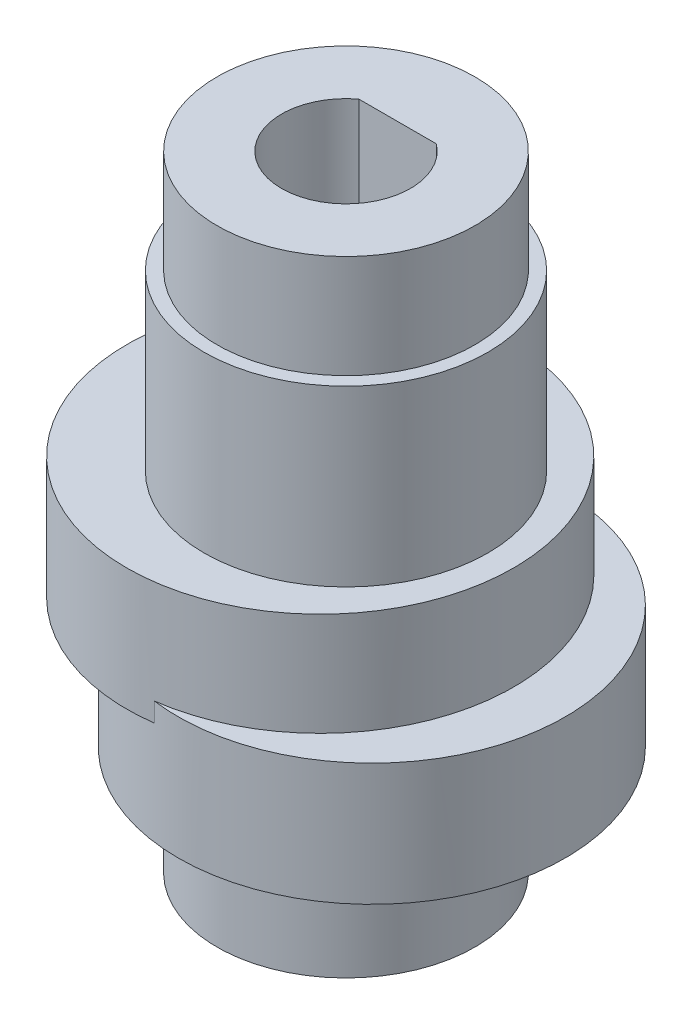
ISO-10303-21;
HEADER;
FILE_DESCRIPTION(('STEP AP214'),'2;1');
FILE_NAME('part.step','',(''),(''),'','','');
FILE_SCHEMA(('AUTOMOTIVE_DESIGN { 1 0 10303 214 1 1 1 1 }'));
ENDSEC;
DATA;
#1=APPLICATION_CONTEXT('core data for automotive mechanical design processes');
#2=APPLICATION_PROTOCOL_DEFINITION('international standard','automotive_design',2000,#1);
#3=PRODUCT_CONTEXT('',#1,'mechanical');
#4=PRODUCT('Part','Part','',(#3));
#5=PRODUCT_RELATED_PRODUCT_CATEGORY('part','',(#4));
#6=PRODUCT_DEFINITION_FORMATION('','',#4);
#7=PRODUCT_DEFINITION_CONTEXT('part definition',#1,'design');
#8=PRODUCT_DEFINITION('design','',#6,#7);
#9=PRODUCT_DEFINITION_SHAPE('','',#8);
#10=(LENGTH_UNIT() NAMED_UNIT(*) SI_UNIT(.MILLI.,.METRE.));
#11=(NAMED_UNIT(*) PLANE_ANGLE_UNIT() SI_UNIT($,.RADIAN.));
#12=(NAMED_UNIT(*) SI_UNIT($,.STERADIAN.) SOLID_ANGLE_UNIT());
#13=UNCERTAINTY_MEASURE_WITH_UNIT(LENGTH_MEASURE(1.E-05),#10,'distance_accuracy_value','');
#14=(GEOMETRIC_REPRESENTATION_CONTEXT(3) GLOBAL_UNCERTAINTY_ASSIGNED_CONTEXT((#13)) GLOBAL_UNIT_ASSIGNED_CONTEXT((#10,
#11,#12)) REPRESENTATION_CONTEXT('',''));
#15=CARTESIAN_POINT('',(0.,0.,0.));
#16=DIRECTION('',(0.,0.,1.));
#17=DIRECTION('',(1.,0.,0.));
#18=AXIS2_PLACEMENT_3D('',#15,#16,#17);
#19=CARTESIAN_POINT('',(0.,-4.,0.));
#20=DIRECTION('',(0.,1.,0.));
#21=DIRECTION('',(0.,0.,1.));
#22=AXIS2_PLACEMENT_3D('',#19,#20,#21);
#23=PLANE('',#22);
#24=CARTESIAN_POINT('',(1.,-4.,0.));
#25=DIRECTION('',(0.,1.,0.));
#26=DIRECTION('',(0.,0.,1.));
#27=AXIS2_PLACEMENT_3D('',#24,#25,#26);
#28=CIRCLE('',#27,7.5);
#29=CARTESIAN_POINT('',(1.,-4.,7.5));
#30=VERTEX_POINT('',#29);
#31=EDGE_CURVE('E128',#30,#30,#28,.T.);
#32=ORIENTED_EDGE('',*,*,#31,.F.);
#33=EDGE_LOOP('',(#32));
#34=FACE_BOUND('',#33,.T.);
#35=CARTESIAN_POINT('',(0.,-4.,0.));
#36=DIRECTION('',(0.,1.,0.));
#37=DIRECTION('',(0.,0.,1.));
#38=AXIS2_PLACEMENT_3D('',#35,#36,#37);
#39=CIRCLE('',#38,5.5);
#40=CARTESIAN_POINT('',(0.,-4.,5.5));
#41=VERTEX_POINT('',#40);
#42=EDGE_CURVE('E51',#41,#41,#39,.F.);
#43=ORIENTED_EDGE('',*,*,#42,.F.);
#44=EDGE_LOOP('',(#43));
#45=FACE_BOUND('',#44,.T.);
#46=ADVANCED_FACE('F43',(#34,#45),#23,.F.);
#47=CARTESIAN_POINT('',(-1.,4.74,0.));
#48=DIRECTION('',(0.,-1.,0.));
#49=DIRECTION('',(0.,0.,-1.));
#50=AXIS2_PLACEMENT_3D('',#47,#48,#49);
#51=CYLINDRICAL_SURFACE('',#50,7.5);
#52=CARTESIAN_POINT('',(-1.,4.74,0.));
#53=DIRECTION('',(0.,1.,0.));
#54=DIRECTION('',(0.,0.,1.));
#55=AXIS2_PLACEMENT_3D('',#52,#53,#54);
#56=CIRCLE('',#55,7.5);
#57=CARTESIAN_POINT('',(-1.,4.74,7.5));
#58=VERTEX_POINT('',#57);
#59=EDGE_CURVE('E139',#58,#58,#56,.T.);
#60=ORIENTED_EDGE('',*,*,#59,.F.);
#61=EDGE_LOOP('',(#60));
#62=FACE_BOUND('',#61,.T.);
#63=DIRECTION('',(0.,-1.,0.));
#64=VECTOR('',#63,1.);
#65=CARTESIAN_POINT('',(0.,0.74,7.43303437365925));
#66=LINE('',#65,#64);
#67=CARTESIAN_POINT('',(0.,0.74,7.43303437365925));
#68=VERTEX_POINT('',#67);
#69=CARTESIAN_POINT('',(0.,0.,7.43303437365925));
#70=VERTEX_POINT('',#69);
#71=EDGE_CURVE('E63',#68,#70,#66,.T.);
#72=ORIENTED_EDGE('',*,*,#71,.F.);
#73=CARTESIAN_POINT('',(-1.,0.74,0.));
#74=DIRECTION('',(0.,1.,0.));
#75=DIRECTION('',(0.,0.,1.));
#76=AXIS2_PLACEMENT_3D('',#73,#74,#75);
#77=CIRCLE('',#76,7.5);
#78=CARTESIAN_POINT('',(0.,0.74,-7.43303437365925));
#79=VERTEX_POINT('',#78);
#80=EDGE_CURVE('E58',#68,#79,#77,.T.);
#81=ORIENTED_EDGE('',*,*,#80,.T.);
#82=DIRECTION('',(0.,-1.,0.));
#83=VECTOR('',#82,1.);
#84=CARTESIAN_POINT('',(0.,0.74,-7.43303437365925));
#85=LINE('',#84,#83);
#86=CARTESIAN_POINT('',(0.,0.,-7.43303437365925));
#87=VERTEX_POINT('',#86);
#88=EDGE_CURVE('E135',#79,#87,#85,.T.);
#89=ORIENTED_EDGE('',*,*,#88,.T.);
#90=CARTESIAN_POINT('',(-1.,0.,0.));
#91=DIRECTION('',(0.,1.,0.));
#92=DIRECTION('',(0.,0.,1.));
#93=AXIS2_PLACEMENT_3D('',#90,#91,#92);
#94=CIRCLE('',#93,7.5);
#95=EDGE_CURVE('E138',#87,#70,#94,.T.);
#96=ORIENTED_EDGE('',*,*,#95,.T.);
#97=EDGE_LOOP('',(#72,#81,#89,#96));
#98=FACE_BOUND('',#97,.T.);
#99=ADVANCED_FACE('F45',(#62,#98),#51,.T.);
#100=CARTESIAN_POINT('',(0.,4.74,0.));
#101=DIRECTION('',(0.,-1.,0.));
#102=DIRECTION('',(0.,0.,-1.));
#103=AXIS2_PLACEMENT_3D('',#100,#101,#102);
#104=CYLINDRICAL_SURFACE('',#103,2.5);
#105=CARTESIAN_POINT('',(0.,-8.74,0.));
#106=DIRECTION('',(0.,-1.,0.));
#107=DIRECTION('',(0.,0.,-1.));
#108=AXIS2_PLACEMENT_3D('',#105,#106,#107);
#109=CIRCLE('',#108,2.5);
#110=CARTESIAN_POINT('',(-1.5,-8.74,-2.));
#111=VERTEX_POINT('',#110);
#112=CARTESIAN_POINT('',(1.5,-8.74,-2.));
#113=VERTEX_POINT('',#112);
#114=EDGE_CURVE('E91',#111,#113,#109,.F.);
#115=ORIENTED_EDGE('',*,*,#114,.F.);
#116=DIRECTION('',(0.,-1.,0.));
#117=VECTOR('',#116,1.);
#118=CARTESIAN_POINT('',(-1.5,4.74,-2.));
#119=LINE('',#118,#117);
#120=CARTESIAN_POINT('',(-1.5,15.48,-2.));
#121=VERTEX_POINT('',#120);
#122=EDGE_CURVE('E85',#121,#111,#119,.T.);
#123=ORIENTED_EDGE('',*,*,#122,.F.);
#124=CARTESIAN_POINT('',(0.,15.48,0.));
#125=DIRECTION('',(0.,-1.,0.));
#126=DIRECTION('',(0.,0.,-1.));
#127=AXIS2_PLACEMENT_3D('',#124,#125,#126);
#128=CIRCLE('',#127,2.5);
#129=CARTESIAN_POINT('',(1.5,15.48,-2.));
#130=VERTEX_POINT('',#129);
#131=EDGE_CURVE('E89',#121,#130,#128,.F.);
#132=ORIENTED_EDGE('',*,*,#131,.T.);
#133=DIRECTION('',(0.,-1.,0.));
#134=VECTOR('',#133,1.);
#135=CARTESIAN_POINT('',(1.5,4.74,-2.));
#136=LINE('',#135,#134);
#137=EDGE_CURVE('E95',#130,#113,#136,.T.);
#138=ORIENTED_EDGE('',*,*,#137,.T.);
#139=EDGE_LOOP('',(#115,#123,#132,#138));
#140=FACE_BOUND('',#139,.T.);
#141=ADVANCED_FACE('F87',(#140),#104,.F.);
#142=CARTESIAN_POINT('',(0.,4.74,-2.));
#143=DIRECTION('',(0.,0.,-1.));
#144=DIRECTION('',(-1.,0.,0.));
#145=AXIS2_PLACEMENT_3D('',#142,#143,#144);
#146=PLANE('',#145);
#147=DIRECTION('',(-1.,0.,0.));
#148=VECTOR('',#147,1.);
#149=CARTESIAN_POINT('',(0.,-8.74,-2.));
#150=LINE('',#149,#148);
#151=EDGE_CURVE('E121',#113,#111,#150,.T.);
#152=ORIENTED_EDGE('',*,*,#151,.F.);
#153=ORIENTED_EDGE('',*,*,#137,.F.);
#154=DIRECTION('',(-1.,0.,0.));
#155=VECTOR('',#154,1.);
#156=CARTESIAN_POINT('',(0.,15.48,-2.));
#157=LINE('',#156,#155);
#158=EDGE_CURVE('E98',#130,#121,#157,.T.);
#159=ORIENTED_EDGE('',*,*,#158,.T.);
#160=ORIENTED_EDGE('',*,*,#122,.T.);
#161=EDGE_LOOP('',(#152,#153,#159,#160));
#162=FACE_BOUND('',#161,.T.);
#163=ADVANCED_FACE('F99',(#162),#146,.F.);
#164=CARTESIAN_POINT('',(0.,4.74,0.));
#165=DIRECTION('',(0.,1.,0.));
#166=DIRECTION('',(0.,0.,1.));
#167=AXIS2_PLACEMENT_3D('',#164,#165,#166);
#168=PLANE('',#167);
#169=CARTESIAN_POINT('',(0.,4.74,0.));
#170=DIRECTION('',(0.,1.,0.));
#171=DIRECTION('',(0.,0.,1.));
#172=AXIS2_PLACEMENT_3D('',#169,#170,#171);
#173=CIRCLE('',#172,5.5);
#174=CARTESIAN_POINT('',(0.,4.74,-5.5));
#175=VERTEX_POINT('',#174);
#176=EDGE_CURVE('E11',#175,#175,#173,.T.);
#177=ORIENTED_EDGE('',*,*,#176,.F.);
#178=EDGE_LOOP('',(#177));
#179=FACE_BOUND('',#178,.T.);
#180=ORIENTED_EDGE('',*,*,#59,.T.);
#181=EDGE_LOOP('',(#180));
#182=FACE_BOUND('',#181,.T.);
#183=ADVANCED_FACE('F169',(#179,#182),#168,.T.);
#184=CARTESIAN_POINT('',(0.,0.,0.));
#185=DIRECTION('',(0.,1.,0.));
#186=DIRECTION('',(0.,0.,1.));
#187=AXIS2_PLACEMENT_3D('',#184,#185,#186);
#188=PLANE('',#187);
#189=ORIENTED_EDGE('',*,*,#95,.F.);
#190=CARTESIAN_POINT('',(1.,0.,0.));
#191=DIRECTION('',(0.,1.,0.));
#192=DIRECTION('',(0.,0.,1.));
#193=AXIS2_PLACEMENT_3D('',#190,#191,#192);
#194=CIRCLE('',#193,7.5);
#195=EDGE_CURVE('E127',#87,#70,#194,.T.);
#196=ORIENTED_EDGE('',*,*,#195,.T.);
#197=EDGE_LOOP('',(#189,#196));
#198=FACE_BOUND('',#197,.T.);
#199=ADVANCED_FACE('F167',(#198),#188,.F.);
#200=CARTESIAN_POINT('',(1.,0.74,0.));
#201=DIRECTION('',(0.,-1.,0.));
#202=DIRECTION('',(0.,0.,-1.));
#203=AXIS2_PLACEMENT_3D('',#200,#201,#202);
#204=CYLINDRICAL_SURFACE('',#203,7.5);
#205=ORIENTED_EDGE('',*,*,#71,.T.);
#206=ORIENTED_EDGE('',*,*,#195,.F.);
#207=ORIENTED_EDGE('',*,*,#88,.F.);
#208=CARTESIAN_POINT('',(1.,0.74,0.));
#209=DIRECTION('',(0.,1.,0.));
#210=DIRECTION('',(0.,0.,1.));
#211=AXIS2_PLACEMENT_3D('',#208,#209,#210);
#212=CIRCLE('',#211,7.5);
#213=EDGE_CURVE('E133',#68,#79,#212,.T.);
#214=ORIENTED_EDGE('',*,*,#213,.F.);
#215=EDGE_LOOP('',(#205,#206,#207,#214));
#216=FACE_BOUND('',#215,.T.);
#217=ORIENTED_EDGE('',*,*,#31,.T.);
#218=EDGE_LOOP('',(#217));
#219=FACE_BOUND('',#218,.T.);
#220=ADVANCED_FACE('F163',(#216,#219),#204,.T.);
#221=CARTESIAN_POINT('',(0.,0.74,0.));
#222=DIRECTION('',(0.,1.,0.));
#223=DIRECTION('',(0.,0.,1.));
#224=AXIS2_PLACEMENT_3D('',#221,#222,#223);
#225=PLANE('',#224);
#226=ORIENTED_EDGE('',*,*,#80,.F.);
#227=ORIENTED_EDGE('',*,*,#213,.T.);
#228=EDGE_LOOP('',(#226,#227));
#229=FACE_BOUND('',#228,.T.);
#230=ADVANCED_FACE('F160',(#229),#225,.T.);
#231=CARTESIAN_POINT('',(0.,-8.74,0.));
#232=DIRECTION('',(0.,1.,0.));
#233=DIRECTION('',(0.,0.,1.));
#234=AXIS2_PLACEMENT_3D('',#231,#232,#233);
#235=CYLINDRICAL_SURFACE('',#234,5.);
#236=CARTESIAN_POINT('',(0.,-4.74,0.));
#237=DIRECTION('',(0.,-1.,0.));
#238=DIRECTION('',(0.,0.,-1.));
#239=AXIS2_PLACEMENT_3D('',#236,#237,#238);
#240=CIRCLE('',#239,5.);
#241=CARTESIAN_POINT('',(0.,-4.74,-5.));
#242=VERTEX_POINT('',#241);
#243=EDGE_CURVE('E115',#242,#242,#240,.T.);
#244=ORIENTED_EDGE('',*,*,#243,.T.);
#245=EDGE_LOOP('',(#244));
#246=FACE_BOUND('',#245,.T.);
#247=CARTESIAN_POINT('',(0.,-8.74,0.));
#248=DIRECTION('',(0.,-1.,0.));
#249=DIRECTION('',(0.,0.,-1.));
#250=AXIS2_PLACEMENT_3D('',#247,#248,#249);
#251=CIRCLE('',#250,5.);
#252=CARTESIAN_POINT('',(0.,-8.74,-5.));
#253=VERTEX_POINT('',#252);
#254=EDGE_CURVE('E124',#253,#253,#251,.T.);
#255=ORIENTED_EDGE('',*,*,#254,.F.);
#256=EDGE_LOOP('',(#255));
#257=FACE_BOUND('',#256,.T.);
#258=ADVANCED_FACE('F158',(#246,#257),#235,.T.);
#259=CARTESIAN_POINT('',(0.,-8.74,0.));
#260=DIRECTION('',(0.,-1.,0.));
#261=DIRECTION('',(0.,0.,-1.));
#262=AXIS2_PLACEMENT_3D('',#259,#260,#261);
#263=PLANE('',#262);
#264=ORIENTED_EDGE('',*,*,#151,.T.);
#265=ORIENTED_EDGE('',*,*,#114,.T.);
#266=EDGE_LOOP('',(#264,#265));
#267=FACE_BOUND('',#266,.T.);
#268=ORIENTED_EDGE('',*,*,#254,.T.);
#269=EDGE_LOOP('',(#268));
#270=FACE_BOUND('',#269,.T.);
#271=ADVANCED_FACE('F213',(#267,#270),#263,.T.);
#272=CARTESIAN_POINT('',(0.,-4.74,0.));
#273=DIRECTION('',(0.,-1.,0.));
#274=DIRECTION('',(0.,0.,-1.));
#275=AXIS2_PLACEMENT_3D('',#272,#273,#274);
#276=PLANE('',#275);
#277=CARTESIAN_POINT('',(0.,-4.74,0.));
#278=DIRECTION('',(0.,-1.,0.));
#279=DIRECTION('',(0.,0.,-1.));
#280=AXIS2_PLACEMENT_3D('',#277,#278,#279);
#281=CIRCLE('',#280,5.5);
#282=CARTESIAN_POINT('',(0.,-4.74,-5.5));
#283=VERTEX_POINT('',#282);
#284=EDGE_CURVE('E118',#283,#283,#281,.T.);
#285=ORIENTED_EDGE('',*,*,#284,.T.);
#286=EDGE_LOOP('',(#285));
#287=FACE_BOUND('',#286,.T.);
#288=ORIENTED_EDGE('',*,*,#243,.F.);
#289=EDGE_LOOP('',(#288));
#290=FACE_BOUND('',#289,.T.);
#291=ADVANCED_FACE('F220',(#287,#290),#276,.T.);
#292=CARTESIAN_POINT('',(0.,-4.74,0.));
#293=DIRECTION('',(0.,1.,0.));
#294=DIRECTION('',(0.,0.,1.));
#295=AXIS2_PLACEMENT_3D('',#292,#293,#294);
#296=CYLINDRICAL_SURFACE('',#295,5.5);
#297=ORIENTED_EDGE('',*,*,#284,.F.);
#298=EDGE_LOOP('',(#297));
#299=FACE_BOUND('',#298,.T.);
#300=ORIENTED_EDGE('',*,*,#42,.T.);
#301=EDGE_LOOP('',(#300));
#302=FACE_BOUND('',#301,.T.);
#303=ADVANCED_FACE('F146',(#299,#302),#296,.T.);
#304=CARTESIAN_POINT('',(0.,11.48,0.));
#305=DIRECTION('',(0.,-1.,0.));
#306=DIRECTION('',(0.,0.,-1.));
#307=AXIS2_PLACEMENT_3D('',#304,#305,#306);
#308=CYLINDRICAL_SURFACE('',#307,5.5);
#309=CARTESIAN_POINT('',(0.,11.48,0.));
#310=DIRECTION('',(0.,-1.,0.));
#311=DIRECTION('',(0.,0.,-1.));
#312=AXIS2_PLACEMENT_3D('',#309,#310,#311);
#313=CIRCLE('',#312,5.5);
#314=CARTESIAN_POINT('',(0.,11.48,-5.5));
#315=VERTEX_POINT('',#314);
#316=EDGE_CURVE('E112',#315,#315,#313,.T.);
#317=CARTESIAN_POINT('',(0.,4.74,-5.5));
#318=CARTESIAN_POINT('',(0.,4.81020833333333,-5.5));
#319=CARTESIAN_POINT('',(0.,4.88041666666667,-5.5));
#320=CARTESIAN_POINT('',(0.,5.02083333333333,-5.5));
#321=CARTESIAN_POINT('',(0.,5.09104166666667,-5.5));
#322=CARTESIAN_POINT('',(0.,5.23145833333333,-5.5));
#323=CARTESIAN_POINT('',(0.,5.30166666666667,-5.5));
#324=CARTESIAN_POINT('',(0.,5.44208333333333,-5.5));
#325=CARTESIAN_POINT('',(0.,5.51229166666667,-5.5));
#326=CARTESIAN_POINT('',(0.,5.65270833333333,-5.5));
#327=CARTESIAN_POINT('',(0.,5.72291666666667,-5.5));
#328=CARTESIAN_POINT('',(0.,5.86333333333333,-5.5));
#329=CARTESIAN_POINT('',(0.,5.93354166666667,-5.5));
#330=CARTESIAN_POINT('',(0.,6.07395833333333,-5.5));
#331=CARTESIAN_POINT('',(0.,6.14416666666667,-5.5));
#332=CARTESIAN_POINT('',(0.,6.28458333333333,-5.5));
#333=CARTESIAN_POINT('',(0.,6.35479166666667,-5.5));
#334=CARTESIAN_POINT('',(0.,6.49520833333334,-5.5));
#335=CARTESIAN_POINT('',(0.,6.56541666666667,-5.5));
#336=CARTESIAN_POINT('',(0.,6.70583333333333,-5.5));
#337=CARTESIAN_POINT('',(0.,6.77604166666667,-5.5));
#338=CARTESIAN_POINT('',(0.,6.91645833333333,-5.5));
#339=CARTESIAN_POINT('',(0.,6.98666666666667,-5.5));
#340=CARTESIAN_POINT('',(0.,7.12708333333333,-5.5));
#341=CARTESIAN_POINT('',(0.,7.19729166666667,-5.5));
#342=CARTESIAN_POINT('',(0.,7.33770833333333,-5.5));
#343=CARTESIAN_POINT('',(0.,7.40791666666667,-5.5));
#344=CARTESIAN_POINT('',(0.,7.54833333333333,-5.5));
#345=CARTESIAN_POINT('',(0.,7.61854166666667,-5.5));
#346=CARTESIAN_POINT('',(0.,7.75895833333333,-5.5));
#347=CARTESIAN_POINT('',(0.,7.82916666666667,-5.5));
#348=CARTESIAN_POINT('',(0.,7.96958333333333,-5.5));
#349=CARTESIAN_POINT('',(0.,8.03979166666667,-5.5));
#350=CARTESIAN_POINT('',(0.,8.18020833333333,-5.5));
#351=CARTESIAN_POINT('',(0.,8.25041666666667,-5.5));
#352=CARTESIAN_POINT('',(0.,8.39083333333333,-5.5));
#353=CARTESIAN_POINT('',(0.,8.46104166666667,-5.5));
#354=CARTESIAN_POINT('',(0.,8.60145833333333,-5.5));
#355=CARTESIAN_POINT('',(0.,8.67166666666667,-5.5));
#356=CARTESIAN_POINT('',(0.,8.81208333333334,-5.5));
#357=CARTESIAN_POINT('',(0.,8.88229166666667,-5.5));
#358=CARTESIAN_POINT('',(0.,9.02270833333333,-5.5));
#359=CARTESIAN_POINT('',(0.,9.09291666666667,-5.5));
#360=CARTESIAN_POINT('',(0.,9.23333333333333,-5.5));
#361=CARTESIAN_POINT('',(0.,9.30354166666667,-5.5));
#362=CARTESIAN_POINT('',(0.,9.44395833333333,-5.5));
#363=CARTESIAN_POINT('',(0.,9.51416666666667,-5.5));
#364=CARTESIAN_POINT('',(0.,9.65458333333333,-5.5));
#365=CARTESIAN_POINT('',(0.,9.72479166666667,-5.5));
#366=CARTESIAN_POINT('',(0.,9.86520833333334,-5.5));
#367=CARTESIAN_POINT('',(0.,9.93541666666667,-5.5));
#368=CARTESIAN_POINT('',(0.,10.0758333333333,-5.5));
#369=CARTESIAN_POINT('',(0.,10.1460416666667,-5.5));
#370=CARTESIAN_POINT('',(0.,10.2864583333333,-5.5));
#371=CARTESIAN_POINT('',(0.,10.3566666666667,-5.5));
#372=CARTESIAN_POINT('',(0.,10.4970833333333,-5.5));
#373=CARTESIAN_POINT('',(0.,10.5672916666667,-5.5));
#374=CARTESIAN_POINT('',(0.,10.7077083333333,-5.5));
#375=CARTESIAN_POINT('',(0.,10.7779166666667,-5.5));
#376=CARTESIAN_POINT('',(0.,10.9183333333333,-5.5));
#377=CARTESIAN_POINT('',(0.,10.9885416666667,-5.5));
#378=CARTESIAN_POINT('',(0.,11.1289583333333,-5.5));
#379=CARTESIAN_POINT('',(0.,11.1991666666667,-5.5));
#380=CARTESIAN_POINT('',(0.,11.3395833333333,-5.5));
#381=CARTESIAN_POINT('',(0.,11.4097916666667,-5.5));
#382=CARTESIAN_POINT('',(0.,11.48,-5.5));
#383=B_SPLINE_CURVE_WITH_KNOTS('',3,(#317,#318,#319,#320,#321,#322,#323,#324,#325,#326,#327,
#328,#329,#330,#331,#332,#333,#334,#335,#336,#337,#338,#339,#340,#341,#342,#343,#344,#345,#346,
#347,#348,#349,#350,#351,#352,#353,#354,#355,#356,#357,#358,#359,#360,#361,#362,#363,#364,#365,
#366,#367,#368,#369,#370,#371,#372,#373,#374,#375,#376,#377,#378,#379,#380,#381,#382),
.UNSPECIFIED.,.F.,.F.,(4,2,2,2,2,2,2,2,2,2,2,2,2,2,2,2,2,2,2,2,2,2,2,2,2,2,2,2,2,2,2,2,4),(0.,
0.210625,0.42125,0.631875000000001,0.8425,1.053125,1.26375,1.474375,1.685,1.895625,2.10625,
2.316875,2.5275,2.738125,2.94875,3.159375,3.37,3.580625,3.79125,4.001875,4.2125,4.423125,
4.63375,4.844375,5.055,5.265625,5.47625,5.686875,5.8975,6.108125,6.31875,6.529375,6.74),.UNSPECIFIED.);
#384=EDGE_CURVE('BSEAM232',#175,#315,#383,.T.);
#385=ORIENTED_EDGE('',*,*,#176,.T.);
#386=ORIENTED_EDGE('',*,*,#316,.T.);
#387=ORIENTED_EDGE('',*,*,#384,.T.);
#388=ORIENTED_EDGE('',*,*,#384,.F.);
#389=EDGE_LOOP('',(#385,#387,#386,#388));
#390=FACE_BOUND('',#389,.T.);
#391=ADVANCED_FACE('F232',(#390),#308,.T.);
#392=CARTESIAN_POINT('',(0.,11.48,0.));
#393=DIRECTION('',(0.,-1.,0.));
#394=DIRECTION('',(0.,0.,-1.));
#395=AXIS2_PLACEMENT_3D('',#392,#393,#394);
#396=PLANE('',#395);
#397=CARTESIAN_POINT('',(0.,11.48,0.));
#398=DIRECTION('',(0.,-1.,0.));
#399=DIRECTION('',(0.,0.,-1.));
#400=AXIS2_PLACEMENT_3D('',#397,#398,#399);
#401=CIRCLE('',#400,5.);
#402=CARTESIAN_POINT('',(0.,11.48,-5.));
#403=VERTEX_POINT('',#402);
#404=EDGE_CURVE('E107',#403,#403,#401,.T.);
#405=ORIENTED_EDGE('',*,*,#404,.T.);
#406=EDGE_LOOP('',(#405));
#407=FACE_BOUND('',#406,.T.);
#408=ORIENTED_EDGE('',*,*,#316,.F.);
#409=EDGE_LOOP('',(#408));
#410=FACE_BOUND('',#409,.T.);
#411=ADVANCED_FACE('F239',(#407,#410),#396,.F.);
#412=CARTESIAN_POINT('',(0.,15.48,0.));
#413=DIRECTION('',(0.,-1.,0.));
#414=DIRECTION('',(0.,0.,-1.));
#415=AXIS2_PLACEMENT_3D('',#412,#413,#414);
#416=CYLINDRICAL_SURFACE('',#415,5.);
#417=CARTESIAN_POINT('',(0.,15.48,0.));
#418=DIRECTION('',(0.,-1.,0.));
#419=DIRECTION('',(0.,0.,-1.));
#420=AXIS2_PLACEMENT_3D('',#417,#418,#419);
#421=CIRCLE('',#420,5.);
#422=CARTESIAN_POINT('',(0.,15.48,-5.));
#423=VERTEX_POINT('',#422);
#424=EDGE_CURVE('E104',#423,#423,#421,.T.);
#425=ORIENTED_EDGE('',*,*,#424,.T.);
#426=EDGE_LOOP('',(#425));
#427=FACE_BOUND('',#426,.T.);
#428=ORIENTED_EDGE('',*,*,#404,.F.);
#429=EDGE_LOOP('',(#428));
#430=FACE_BOUND('',#429,.T.);
#431=ADVANCED_FACE('F246',(#427,#430),#416,.T.);
#432=CARTESIAN_POINT('',(0.,15.48,0.));
#433=DIRECTION('',(0.,-1.,0.));
#434=DIRECTION('',(0.,0.,-1.));
#435=AXIS2_PLACEMENT_3D('',#432,#433,#434);
#436=PLANE('',#435);
#437=ORIENTED_EDGE('',*,*,#158,.F.);
#438=ORIENTED_EDGE('',*,*,#131,.F.);
#439=EDGE_LOOP('',(#437,#438));
#440=FACE_BOUND('',#439,.T.);
#441=ORIENTED_EDGE('',*,*,#424,.F.);
#442=EDGE_LOOP('',(#441));
#443=FACE_BOUND('',#442,.T.);
#444=ADVANCED_FACE('F102',(#440,#443),#436,.F.);
#445=CLOSED_SHELL('',(#46,#99,#141,#163,#183,#199,#220,#230,#258,#271,#291,#303,#391,#411,#431,#444));
#446=MANIFOLD_SOLID_BREP('B2',#445);
#447=ADVANCED_BREP_SHAPE_REPRESENTATION('',(#18,#446),#14);
#448=SHAPE_DEFINITION_REPRESENTATION(#9,#447);
ENDSEC;
END-ISO-10303-21;
